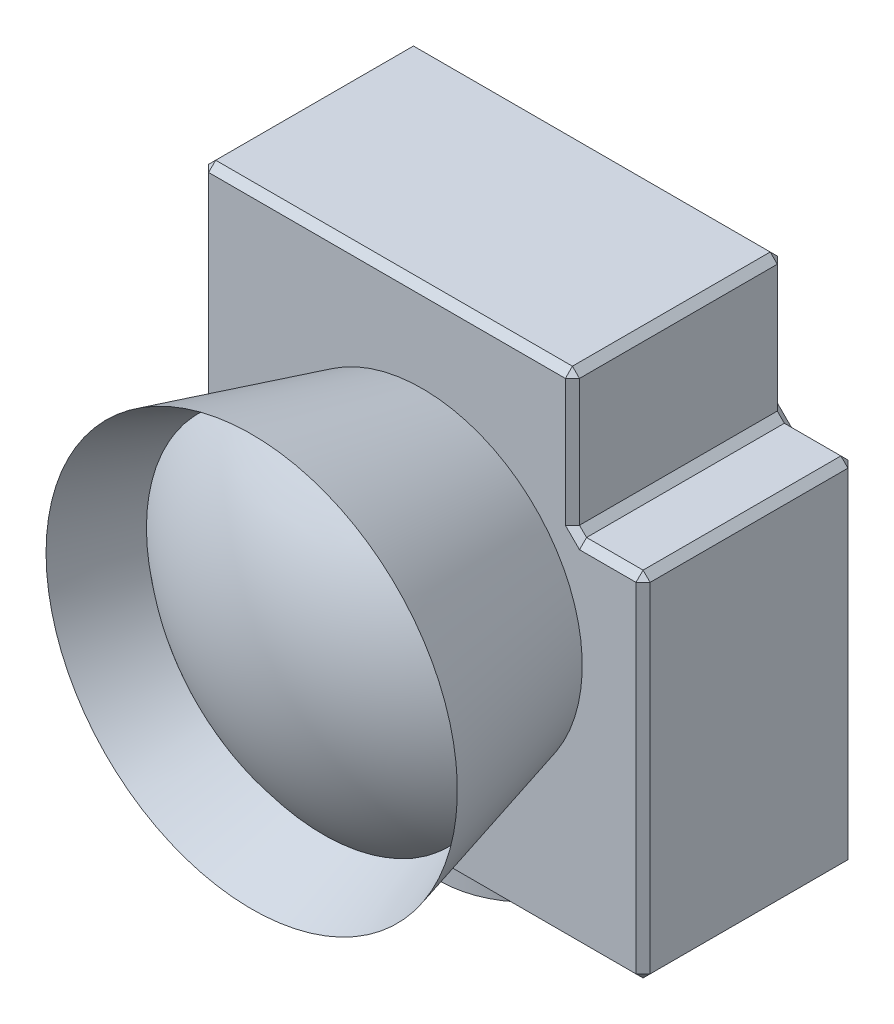
ISO-10303-21;
HEADER;
FILE_DESCRIPTION(('STEP AP214'),'2;1');
FILE_NAME('part.step','',(''),(''),'','','');
FILE_SCHEMA(('AUTOMOTIVE_DESIGN { 1 0 10303 214 1 1 1 1 }'));
ENDSEC;
DATA;
#1=APPLICATION_CONTEXT('core data for automotive mechanical design processes');
#2=APPLICATION_PROTOCOL_DEFINITION('international standard','automotive_design',2000,#1);
#3=PRODUCT_CONTEXT('',#1,'mechanical');
#4=PRODUCT('Part','Part','',(#3));
#5=PRODUCT_RELATED_PRODUCT_CATEGORY('part','',(#4));
#6=PRODUCT_DEFINITION_FORMATION('','',#4);
#7=PRODUCT_DEFINITION_CONTEXT('part definition',#1,'design');
#8=PRODUCT_DEFINITION('design','',#6,#7);
#9=PRODUCT_DEFINITION_SHAPE('','',#8);
#10=(LENGTH_UNIT() NAMED_UNIT(*) SI_UNIT(.MILLI.,.METRE.));
#11=(NAMED_UNIT(*) PLANE_ANGLE_UNIT() SI_UNIT($,.RADIAN.));
#12=(NAMED_UNIT(*) SI_UNIT($,.STERADIAN.) SOLID_ANGLE_UNIT());
#13=UNCERTAINTY_MEASURE_WITH_UNIT(LENGTH_MEASURE(1.E-05),#10,'distance_accuracy_value','');
#14=(GEOMETRIC_REPRESENTATION_CONTEXT(3) GLOBAL_UNCERTAINTY_ASSIGNED_CONTEXT((#13)) GLOBAL_UNIT_ASSIGNED_CONTEXT((#10,
#11,#12)) REPRESENTATION_CONTEXT('',''));
#15=CARTESIAN_POINT('',(0.,0.,0.));
#16=DIRECTION('',(0.,0.,1.));
#17=DIRECTION('',(1.,0.,0.));
#18=AXIS2_PLACEMENT_3D('',#15,#16,#17);
#19=CARTESIAN_POINT('',(0.,0.,33.7501562772454));
#20=CARTESIAN_POINT('',(-12.5291399374517,0.,33.7501562772454));
#21=CARTESIAN_POINT('',(-25.0582798749034,0.,28.9933194314533));
#22=B_SPLINE_CURVE_WITH_KNOTS('',2,(#19,#20,#21),.UNSPECIFIED.,.F.,.F.,(3,3),(0.,0.5),.UNSPECIFIED.);
#23=CARTESIAN_POINT('',(0.,0.,0.));
#24=DIRECTION('',(0.,0.,-1.));
#25=AXIS1_PLACEMENT('',#23,#24);
#26=SURFACE_OF_REVOLUTION('',#22,#25);
#27=CARTESIAN_POINT('',(0.,0.,28.9933194314533));
#28=DIRECTION('',(0.,0.,-1.));
#29=DIRECTION('',(-1.,0.,0.));
#30=AXIS2_PLACEMENT_3D('',#27,#28,#29);
#31=CIRCLE('',#30,25.0582798749034);
#32=CARTESIAN_POINT('',(-25.0582798749034,0.,28.9933194314533));
#33=VERTEX_POINT('',#32);
#34=EDGE_CURVE('E12',#33,#33,#31,.T.);
#35=ORIENTED_EDGE('',*,*,#34,.T.);
#36=EDGE_LOOP('',(#35));
#37=FACE_BOUND('',#36,.T.);
#38=CARTESIAN_POINT('',(0.,0.,33.7501562772454));
#39=VERTEX_POINT('',#38);
#40=VERTEX_LOOP('',#39);
#41=FACE_BOUND('',#40,.T.);
#42=ADVANCED_FACE('F49',(#37,#41),#26,.F.);
#43=CARTESIAN_POINT('',(0.,0.,0.));
#44=DIRECTION('',(0.,0.,-1.));
#45=DIRECTION('',(-1.,0.,0.));
#46=AXIS2_PLACEMENT_3D('',#43,#44,#45);
#47=SPHERICAL_SURFACE('',#46,38.3214034443322);
#48=ORIENTED_EDGE('',*,*,#34,.F.);
#49=EDGE_LOOP('',(#48));
#50=FACE_BOUND('',#49,.T.);
#51=ADVANCED_FACE('F58',(#50),#47,.T.);
#52=CLOSED_SHELL('',(#42,#51));
#53=MANIFOLD_SOLID_BREP('B2',#52);
#54=CARTESIAN_POINT('',(-31.25,35.,15.));
#55=DIRECTION('',(1.,0.,0.));
#56=DIRECTION('',(0.,1.,0.));
#57=AXIS2_PLACEMENT_3D('',#54,#55,#56);
#58=PLANE('',#57);
#59=DIRECTION('',(0.,-1.,0.));
#60=VECTOR('',#59,1.);
#61=CARTESIAN_POINT('',(-31.25,-35.,-14.));
#62=LINE('',#61,#60);
#63=CARTESIAN_POINT('',(-31.25,34.,-14.));
#64=VERTEX_POINT('',#63);
#65=CARTESIAN_POINT('',(-31.25,-34.,-14.));
#66=VERTEX_POINT('',#65);
#67=EDGE_CURVE('E382',#64,#66,#62,.T.);
#68=ORIENTED_EDGE('',*,*,#67,.T.);
#69=DIRECTION('',(0.,0.,1.));
#70=VECTOR('',#69,1.);
#71=CARTESIAN_POINT('',(-31.25,-34.,15.));
#72=LINE('',#71,#70);
#73=CARTESIAN_POINT('',(-31.25,-34.,14.));
#74=VERTEX_POINT('',#73);
#75=EDGE_CURVE('E388',#66,#74,#72,.T.);
#76=ORIENTED_EDGE('',*,*,#75,.T.);
#77=DIRECTION('',(0.,1.,0.));
#78=VECTOR('',#77,1.);
#79=CARTESIAN_POINT('',(-31.25,35.,14.));
#80=LINE('',#79,#78);
#81=CARTESIAN_POINT('',(-31.25,34.,14.));
#82=VERTEX_POINT('',#81);
#83=EDGE_CURVE('E386',#74,#82,#80,.T.);
#84=ORIENTED_EDGE('',*,*,#83,.T.);
#85=DIRECTION('',(0.,0.,-1.));
#86=VECTOR('',#85,1.);
#87=CARTESIAN_POINT('',(-31.25,34.,15.));
#88=LINE('',#87,#86);
#89=EDGE_CURVE('E384',#82,#64,#88,.T.);
#90=ORIENTED_EDGE('',*,*,#89,.T.);
#91=EDGE_LOOP('',(#68,#76,#84,#90));
#92=FACE_BOUND('',#91,.T.);
#93=ADVANCED_FACE('F88',(#92),#58,.F.);
#94=CARTESIAN_POINT('',(31.25,-35.,15.));
#95=DIRECTION('',(0.,1.,0.));
#96=DIRECTION('',(0.,0.,1.));
#97=AXIS2_PLACEMENT_3D('',#94,#95,#96);
#98=PLANE('',#97);
#99=DIRECTION('',(0.,0.,1.));
#100=VECTOR('',#99,1.);
#101=CARTESIAN_POINT('',(30.25,-35.,15.));
#102=LINE('',#101,#100);
#103=CARTESIAN_POINT('',(30.25,-35.,-14.));
#104=VERTEX_POINT('',#103);
#105=CARTESIAN_POINT('',(30.25,-35.,14.));
#106=VERTEX_POINT('',#105);
#107=EDGE_CURVE('E375',#104,#106,#102,.T.);
#108=ORIENTED_EDGE('',*,*,#107,.T.);
#109=DIRECTION('',(-1.,0.,0.));
#110=VECTOR('',#109,1.);
#111=CARTESIAN_POINT('',(31.25,-35.,14.));
#112=LINE('',#111,#110);
#113=CARTESIAN_POINT('',(-30.25,-35.,14.));
#114=VERTEX_POINT('',#113);
#115=EDGE_CURVE('E380',#106,#114,#112,.T.);
#116=ORIENTED_EDGE('',*,*,#115,.T.);
#117=DIRECTION('',(0.,0.,-1.));
#118=VECTOR('',#117,1.);
#119=CARTESIAN_POINT('',(-30.25,-35.,15.));
#120=LINE('',#119,#118);
#121=CARTESIAN_POINT('',(-30.25,-35.,-14.));
#122=VERTEX_POINT('',#121);
#123=EDGE_CURVE('E377',#114,#122,#120,.T.);
#124=ORIENTED_EDGE('',*,*,#123,.T.);
#125=DIRECTION('',(1.,0.,0.));
#126=VECTOR('',#125,1.);
#127=CARTESIAN_POINT('',(31.25,-35.,-14.));
#128=LINE('',#127,#126);
#129=EDGE_CURVE('E369',#122,#104,#128,.T.);
#130=ORIENTED_EDGE('',*,*,#129,.T.);
#131=EDGE_LOOP('',(#108,#116,#124,#130));
#132=FACE_BOUND('',#131,.T.);
#133=CARTESIAN_POINT('',(0.,-35.,0.));
#134=DIRECTION('',(0.,1.,0.));
#135=DIRECTION('',(0.,0.,1.));
#136=AXIS2_PLACEMENT_3D('',#133,#134,#135);
#137=CIRCLE('',#136,12.5);
#138=CARTESIAN_POINT('',(0.,-35.,12.5));
#139=VERTEX_POINT('',#138);
#140=EDGE_CURVE('E364',#139,#139,#137,.F.);
#141=ORIENTED_EDGE('',*,*,#140,.F.);
#142=EDGE_LOOP('',(#141));
#143=FACE_BOUND('',#142,.T.);
#144=ADVANCED_FACE('F520',(#132,#143),#98,.F.);
#145=CARTESIAN_POINT('',(31.25,15.,15.));
#146=DIRECTION('',(-1.,0.,0.));
#147=DIRECTION('',(0.,-1.,0.));
#148=AXIS2_PLACEMENT_3D('',#145,#146,#147);
#149=PLANE('',#148);
#150=DIRECTION('',(0.,0.,1.));
#151=VECTOR('',#150,1.);
#152=CARTESIAN_POINT('',(31.25,14.,15.));
#153=LINE('',#152,#151);
#154=CARTESIAN_POINT('',(31.25,14.,-14.));
#155=VERTEX_POINT('',#154);
#156=CARTESIAN_POINT('',(31.25,14.,14.));
#157=VERTEX_POINT('',#156);
#158=EDGE_CURVE('E393',#155,#157,#153,.T.);
#159=ORIENTED_EDGE('',*,*,#158,.T.);
#160=DIRECTION('',(0.,-1.,0.));
#161=VECTOR('',#160,1.);
#162=CARTESIAN_POINT('',(31.25,15.,14.));
#163=LINE('',#162,#161);
#164=CARTESIAN_POINT('',(31.25,-34.,14.));
#165=VERTEX_POINT('',#164);
#166=EDGE_CURVE('E398',#157,#165,#163,.T.);
#167=ORIENTED_EDGE('',*,*,#166,.T.);
#168=DIRECTION('',(0.,0.,-1.));
#169=VECTOR('',#168,1.);
#170=CARTESIAN_POINT('',(31.25,-34.,15.));
#171=LINE('',#170,#169);
#172=CARTESIAN_POINT('',(31.25,-34.,-14.));
#173=VERTEX_POINT('',#172);
#174=EDGE_CURVE('E395',#165,#173,#171,.T.);
#175=ORIENTED_EDGE('',*,*,#174,.T.);
#176=DIRECTION('',(0.,1.,0.));
#177=VECTOR('',#176,1.);
#178=CARTESIAN_POINT('',(31.25,15.,-14.));
#179=LINE('',#178,#177);
#180=EDGE_CURVE('E391',#173,#155,#179,.T.);
#181=ORIENTED_EDGE('',*,*,#180,.T.);
#182=EDGE_LOOP('',(#159,#167,#175,#181));
#183=FACE_BOUND('',#182,.T.);
#184=ADVANCED_FACE('F475',(#183),#149,.F.);
#185=CARTESIAN_POINT('',(31.25,15.,15.));
#186=DIRECTION('',(0.,-1.,0.));
#187=DIRECTION('',(1.,0.,0.));
#188=AXIS2_PLACEMENT_3D('',#185,#186,#187);
#189=PLANE('',#188);
#190=DIRECTION('',(0.,0.,1.));
#191=VECTOR('',#190,1.);
#192=CARTESIAN_POINT('',(22.25,15.,15.));
#193=LINE('',#192,#191);
#194=CARTESIAN_POINT('',(22.25,15.,-14.));
#195=VERTEX_POINT('',#194);
#196=CARTESIAN_POINT('',(22.25,15.,14.));
#197=VERTEX_POINT('',#196);
#198=EDGE_CURVE('E402',#195,#197,#193,.T.);
#199=ORIENTED_EDGE('',*,*,#198,.T.);
#200=DIRECTION('',(1.,0.,0.));
#201=VECTOR('',#200,1.);
#202=CARTESIAN_POINT('',(31.25,15.,14.));
#203=LINE('',#202,#201);
#204=CARTESIAN_POINT('',(30.25,15.,14.));
#205=VERTEX_POINT('',#204);
#206=EDGE_CURVE('E407',#197,#205,#203,.T.);
#207=ORIENTED_EDGE('',*,*,#206,.T.);
#208=DIRECTION('',(0.,0.,-1.));
#209=VECTOR('',#208,1.);
#210=CARTESIAN_POINT('',(30.25,15.,15.));
#211=LINE('',#210,#209);
#212=CARTESIAN_POINT('',(30.25,15.,-14.));
#213=VERTEX_POINT('',#212);
#214=EDGE_CURVE('E404',#205,#213,#211,.T.);
#215=ORIENTED_EDGE('',*,*,#214,.T.);
#216=DIRECTION('',(-1.,0.,0.));
#217=VECTOR('',#216,1.);
#218=CARTESIAN_POINT('',(21.25,15.,-14.));
#219=LINE('',#218,#217);
#220=EDGE_CURVE('E400',#213,#195,#219,.T.);
#221=ORIENTED_EDGE('',*,*,#220,.T.);
#222=EDGE_LOOP('',(#199,#207,#215,#221));
#223=FACE_BOUND('',#222,.T.);
#224=ADVANCED_FACE('F489',(#223),#189,.F.);
#225=CARTESIAN_POINT('',(21.25,35.,15.));
#226=DIRECTION('',(-1.,0.,0.));
#227=DIRECTION('',(0.,0.,1.));
#228=AXIS2_PLACEMENT_3D('',#225,#226,#227);
#229=PLANE('',#228);
#230=DIRECTION('',(0.,0.,1.));
#231=VECTOR('',#230,1.);
#232=CARTESIAN_POINT('',(21.25,34.,15.));
#233=LINE('',#232,#231);
#234=CARTESIAN_POINT('',(21.25,34.,-14.));
#235=VERTEX_POINT('',#234);
#236=CARTESIAN_POINT('',(21.25,34.,14.));
#237=VERTEX_POINT('',#236);
#238=EDGE_CURVE('E411',#235,#237,#233,.T.);
#239=ORIENTED_EDGE('',*,*,#238,.T.);
#240=DIRECTION('',(0.,-1.,0.));
#241=VECTOR('',#240,1.);
#242=CARTESIAN_POINT('',(21.25,35.,14.));
#243=LINE('',#242,#241);
#244=CARTESIAN_POINT('',(21.25,16.,14.));
#245=VERTEX_POINT('',#244);
#246=EDGE_CURVE('E416',#237,#245,#243,.T.);
#247=ORIENTED_EDGE('',*,*,#246,.T.);
#248=DIRECTION('',(0.,0.,-1.));
#249=VECTOR('',#248,1.);
#250=CARTESIAN_POINT('',(21.25,16.,-15.));
#251=LINE('',#250,#249);
#252=CARTESIAN_POINT('',(21.25,16.,-14.));
#253=VERTEX_POINT('',#252);
#254=EDGE_CURVE('E413',#245,#253,#251,.T.);
#255=ORIENTED_EDGE('',*,*,#254,.T.);
#256=DIRECTION('',(0.,1.,0.));
#257=VECTOR('',#256,1.);
#258=CARTESIAN_POINT('',(21.25,35.,-14.));
#259=LINE('',#258,#257);
#260=EDGE_CURVE('E409',#253,#235,#259,.T.);
#261=ORIENTED_EDGE('',*,*,#260,.T.);
#262=EDGE_LOOP('',(#239,#247,#255,#261));
#263=FACE_BOUND('',#262,.T.);
#264=ADVANCED_FACE('F495',(#263),#229,.F.);
#265=CARTESIAN_POINT('',(21.25,35.,15.));
#266=DIRECTION('',(0.,-1.,0.));
#267=DIRECTION('',(1.,0.,0.));
#268=AXIS2_PLACEMENT_3D('',#265,#266,#267);
#269=PLANE('',#268);
#270=DIRECTION('',(1.,0.,0.));
#271=VECTOR('',#270,1.);
#272=CARTESIAN_POINT('',(21.25,35.,14.));
#273=LINE('',#272,#271);
#274=CARTESIAN_POINT('',(-30.25,35.,14.));
#275=VERTEX_POINT('',#274);
#276=CARTESIAN_POINT('',(20.25,35.,14.));
#277=VERTEX_POINT('',#276);
#278=EDGE_CURVE('E422',#275,#277,#273,.T.);
#279=ORIENTED_EDGE('',*,*,#278,.T.);
#280=DIRECTION('',(0.,0.,-1.));
#281=VECTOR('',#280,1.);
#282=CARTESIAN_POINT('',(20.25,35.,15.));
#283=LINE('',#282,#281);
#284=CARTESIAN_POINT('',(20.25,35.,-14.));
#285=VERTEX_POINT('',#284);
#286=EDGE_CURVE('E424',#277,#285,#283,.T.);
#287=ORIENTED_EDGE('',*,*,#286,.T.);
#288=DIRECTION('',(-1.,0.,0.));
#289=VECTOR('',#288,1.);
#290=CARTESIAN_POINT('',(-31.25,35.,-14.));
#291=LINE('',#290,#289);
#292=CARTESIAN_POINT('',(-30.25,35.,-14.));
#293=VERTEX_POINT('',#292);
#294=EDGE_CURVE('E418',#285,#293,#291,.T.);
#295=ORIENTED_EDGE('',*,*,#294,.T.);
#296=DIRECTION('',(0.,0.,1.));
#297=VECTOR('',#296,1.);
#298=CARTESIAN_POINT('',(-30.25,35.,15.));
#299=LINE('',#298,#297);
#300=EDGE_CURVE('E420',#293,#275,#299,.T.);
#301=ORIENTED_EDGE('',*,*,#300,.T.);
#302=EDGE_LOOP('',(#279,#287,#295,#301));
#303=FACE_BOUND('',#302,.T.);
#304=ADVANCED_FACE('F706',(#303),#269,.F.);
#305=CARTESIAN_POINT('',(0.,0.,15.));
#306=DIRECTION('',(0.,0.,-1.));
#307=DIRECTION('',(-1.,0.,0.));
#308=AXIS2_PLACEMENT_3D('',#305,#306,#307);
#309=PLANE('',#308);
#310=CARTESIAN_POINT('',(0.,0.,15.));
#311=DIRECTION('',(0.,0.,-1.));
#312=DIRECTION('',(-1.,0.,0.));
#313=AXIS2_PLACEMENT_3D('',#310,#311,#312);
#314=CIRCLE('',#313,22.6402714347078);
#315=CARTESIAN_POINT('',(-22.6402714347078,0.,15.));
#316=VERTEX_POINT('',#315);
#317=EDGE_CURVE('E1069',#316,#316,#314,.T.);
#318=ORIENTED_EDGE('',*,*,#317,.T.);
#319=EDGE_LOOP('',(#318));
#320=FACE_BOUND('',#319,.T.);
#321=DIRECTION('',(0.707106781186548,-0.707106781186547,0.));
#322=VECTOR('',#321,1.);
#323=CARTESIAN_POINT('',(22.25,14.,15.));
#324=LINE('',#323,#322);
#325=CARTESIAN_POINT('',(20.25,16.,15.));
#326=VERTEX_POINT('',#325);
#327=CARTESIAN_POINT('',(21.25,15.,15.));
#328=VERTEX_POINT('',#327);
#329=EDGE_CURVE('E230',#326,#328,#324,.T.);
#330=ORIENTED_EDGE('',*,*,#329,.F.);
#331=DIRECTION('',(0.,1.,0.));
#332=VECTOR('',#331,1.);
#333=CARTESIAN_POINT('',(20.25,0.,15.));
#334=LINE('',#333,#332);
#335=CARTESIAN_POINT('',(20.25,34.,15.));
#336=VERTEX_POINT('',#335);
#337=EDGE_CURVE('E244',#326,#336,#334,.T.);
#338=ORIENTED_EDGE('',*,*,#337,.T.);
#339=DIRECTION('',(-1.,0.,0.));
#340=VECTOR('',#339,1.);
#341=CARTESIAN_POINT('',(0.,34.,15.));
#342=LINE('',#341,#340);
#343=CARTESIAN_POINT('',(-30.25,34.,15.));
#344=VERTEX_POINT('',#343);
#345=EDGE_CURVE('E237',#336,#344,#342,.T.);
#346=ORIENTED_EDGE('',*,*,#345,.T.);
#347=DIRECTION('',(0.,-1.,0.));
#348=VECTOR('',#347,1.);
#349=CARTESIAN_POINT('',(-30.25,0.,15.));
#350=LINE('',#349,#348);
#351=CARTESIAN_POINT('',(-30.25,-34.,15.));
#352=VERTEX_POINT('',#351);
#353=EDGE_CURVE('E427',#344,#352,#350,.T.);
#354=ORIENTED_EDGE('',*,*,#353,.T.);
#355=DIRECTION('',(1.,0.,0.));
#356=VECTOR('',#355,1.);
#357=CARTESIAN_POINT('',(0.,-34.,15.));
#358=LINE('',#357,#356);
#359=CARTESIAN_POINT('',(30.25,-34.,15.));
#360=VERTEX_POINT('',#359);
#361=EDGE_CURVE('E429',#352,#360,#358,.T.);
#362=ORIENTED_EDGE('',*,*,#361,.T.);
#363=DIRECTION('',(0.,1.,0.));
#364=VECTOR('',#363,1.);
#365=CARTESIAN_POINT('',(30.25,0.,15.));
#366=LINE('',#365,#364);
#367=CARTESIAN_POINT('',(30.25,14.,15.));
#368=VERTEX_POINT('',#367);
#369=EDGE_CURVE('E431',#360,#368,#366,.T.);
#370=ORIENTED_EDGE('',*,*,#369,.T.);
#371=DIRECTION('',(-1.,0.,0.));
#372=VECTOR('',#371,1.);
#373=CARTESIAN_POINT('',(0.,13.9999999999999,15.));
#374=LINE('',#373,#372);
#375=CARTESIAN_POINT('',(22.25,14.,15.));
#376=VERTEX_POINT('',#375);
#377=EDGE_CURVE('E233',#368,#376,#374,.T.);
#378=ORIENTED_EDGE('',*,*,#377,.T.);
#379=DIRECTION('',(0.707106781186548,-0.707106781186547,0.));
#380=VECTOR('',#379,1.);
#381=CARTESIAN_POINT('',(22.25,14.,15.));
#382=LINE('',#381,#380);
#383=EDGE_CURVE('E227',#328,#376,#382,.T.);
#384=ORIENTED_EDGE('',*,*,#383,.F.);
#385=EDGE_LOOP('',(#330,#338,#346,#354,#362,#370,#378,#384));
#386=FACE_BOUND('',#385,.T.);
#387=ADVANCED_FACE('F229',(#320,#386),#309,.F.);
#388=CARTESIAN_POINT('',(0.,0.,-15.));
#389=DIRECTION('',(0.,0.,-1.));
#390=DIRECTION('',(-1.,0.,0.));
#391=AXIS2_PLACEMENT_3D('',#388,#389,#390);
#392=PLANE('',#391);
#393=DIRECTION('',(1.,0.,0.));
#394=VECTOR('',#393,1.);
#395=CARTESIAN_POINT('',(21.25,34.,-15.));
#396=LINE('',#395,#394);
#397=CARTESIAN_POINT('',(-30.25,34.,-15.));
#398=VERTEX_POINT('',#397);
#399=CARTESIAN_POINT('',(20.25,34.,-15.));
#400=VERTEX_POINT('',#399);
#401=EDGE_CURVE('E260',#398,#400,#396,.T.);
#402=ORIENTED_EDGE('',*,*,#401,.T.);
#403=DIRECTION('',(0.,-1.,0.));
#404=VECTOR('',#403,1.);
#405=CARTESIAN_POINT('',(20.25,15.,-15.));
#406=LINE('',#405,#404);
#407=CARTESIAN_POINT('',(20.25,16.,-15.));
#408=VERTEX_POINT('',#407);
#409=EDGE_CURVE('E47',#400,#408,#406,.T.);
#410=ORIENTED_EDGE('',*,*,#409,.T.);
#411=DIRECTION('',(-0.707106781186548,0.707106781186547,0.));
#412=VECTOR('',#411,1.);
#413=CARTESIAN_POINT('',(18.125,18.125,-15.));
#414=LINE('',#413,#412);
#415=CARTESIAN_POINT('',(21.25,15.,-15.));
#416=VERTEX_POINT('',#415);
#417=EDGE_CURVE('E98',#416,#408,#414,.T.);
#418=ORIENTED_EDGE('',*,*,#417,.F.);
#419=DIRECTION('',(-0.707106781186548,0.707106781186547,0.));
#420=VECTOR('',#419,1.);
#421=CARTESIAN_POINT('',(18.125,18.125,-15.));
#422=LINE('',#421,#420);
#423=CARTESIAN_POINT('',(22.25,14.,-15.));
#424=VERTEX_POINT('',#423);
#425=EDGE_CURVE('E257',#424,#416,#422,.T.);
#426=ORIENTED_EDGE('',*,*,#425,.F.);
#427=DIRECTION('',(1.,0.,0.));
#428=VECTOR('',#427,1.);
#429=CARTESIAN_POINT('',(31.25,14.,-15.));
#430=LINE('',#429,#428);
#431=CARTESIAN_POINT('',(30.25,14.,-15.));
#432=VERTEX_POINT('',#431);
#433=EDGE_CURVE('E255',#424,#432,#430,.T.);
#434=ORIENTED_EDGE('',*,*,#433,.T.);
#435=DIRECTION('',(0.,-1.,0.));
#436=VECTOR('',#435,1.);
#437=CARTESIAN_POINT('',(30.25,-35.,-15.));
#438=LINE('',#437,#436);
#439=CARTESIAN_POINT('',(30.25,-34.,-15.));
#440=VERTEX_POINT('',#439);
#441=EDGE_CURVE('E253',#432,#440,#438,.T.);
#442=ORIENTED_EDGE('',*,*,#441,.T.);
#443=DIRECTION('',(-1.,0.,0.));
#444=VECTOR('',#443,1.);
#445=CARTESIAN_POINT('',(-31.25,-34.,-15.));
#446=LINE('',#445,#444);
#447=CARTESIAN_POINT('',(-30.25,-34.,-15.));
#448=VERTEX_POINT('',#447);
#449=EDGE_CURVE('E251',#440,#448,#446,.T.);
#450=ORIENTED_EDGE('',*,*,#449,.T.);
#451=DIRECTION('',(0.,1.,0.));
#452=VECTOR('',#451,1.);
#453=CARTESIAN_POINT('',(-30.25,35.,-15.));
#454=LINE('',#453,#452);
#455=EDGE_CURVE('E246',#448,#398,#454,.T.);
#456=ORIENTED_EDGE('',*,*,#455,.T.);
#457=EDGE_LOOP('',(#402,#410,#418,#426,#434,#442,#450,#456));
#458=FACE_BOUND('',#457,.T.);
#459=ADVANCED_FACE('F698',(#458),#392,.T.);
#460=CARTESIAN_POINT('',(0.,-39.,0.));
#461=DIRECTION('',(0.,1.,0.));
#462=DIRECTION('',(0.,0.,1.));
#463=AXIS2_PLACEMENT_3D('',#460,#461,#462);
#464=CYLINDRICAL_SURFACE('',#463,12.5);
#465=CARTESIAN_POINT('',(0.,-39.,0.));
#466=DIRECTION('',(0.,-1.,0.));
#467=DIRECTION('',(0.,0.,-1.));
#468=AXIS2_PLACEMENT_3D('',#465,#466,#467);
#469=CIRCLE('',#468,12.5);
#470=CARTESIAN_POINT('',(0.,-39.,-12.5));
#471=VERTEX_POINT('',#470);
#472=EDGE_CURVE('E361',#471,#471,#469,.T.);
#473=ORIENTED_EDGE('',*,*,#472,.F.);
#474=EDGE_LOOP('',(#473));
#475=FACE_BOUND('',#474,.T.);
#476=ORIENTED_EDGE('',*,*,#140,.T.);
#477=EDGE_LOOP('',(#476));
#478=FACE_BOUND('',#477,.T.);
#479=ADVANCED_FACE('F693',(#475,#478),#464,.T.);
#480=CARTESIAN_POINT('',(0.,-39.,0.));
#481=DIRECTION('',(0.,-1.,0.));
#482=DIRECTION('',(0.,0.,-1.));
#483=AXIS2_PLACEMENT_3D('',#480,#481,#482);
#484=PLANE('',#483);
#485=ORIENTED_EDGE('',*,*,#472,.T.);
#486=EDGE_LOOP('',(#485));
#487=FACE_BOUND('',#486,.T.);
#488=ADVANCED_FACE('F689',(#487),#484,.T.);
#489=CARTESIAN_POINT('',(21.25,16.,15.));
#490=DIRECTION('',(0.707106781186547,0.707106781186548,0.));
#491=DIRECTION('',(0.,0.,1.));
#492=AXIS2_PLACEMENT_3D('',#489,#490,#491);
#493=PLANE('',#492);
#494=DIRECTION('',(0.707106781186548,-0.707106781186547,0.));
#495=VECTOR('',#494,1.);
#496=CARTESIAN_POINT('',(22.25,15.,14.));
#497=LINE('',#496,#495);
#498=EDGE_CURVE('E93',#197,#245,#497,.F.);
#499=ORIENTED_EDGE('',*,*,#498,.F.);
#500=ORIENTED_EDGE('',*,*,#198,.F.);
#501=DIRECTION('',(-0.707106781186548,0.707106781186547,0.));
#502=VECTOR('',#501,1.);
#503=CARTESIAN_POINT('',(21.25,16.,-14.));
#504=LINE('',#503,#502);
#505=EDGE_CURVE('E355',#253,#195,#504,.F.);
#506=ORIENTED_EDGE('',*,*,#505,.F.);
#507=ORIENTED_EDGE('',*,*,#254,.F.);
#508=EDGE_LOOP('',(#499,#500,#506,#507));
#509=FACE_BOUND('',#508,.T.);
#510=ADVANCED_FACE('F91',(#509),#493,.T.);
#511=CARTESIAN_POINT('',(22.25,15.,14.));
#512=DIRECTION('',(0.577350269189625,0.577350269189626,0.577350269189626));
#513=DIRECTION('',(0.,-0.707106781186548,0.707106781186548));
#514=AXIS2_PLACEMENT_3D('',#511,#512,#513);
#515=PLANE('',#514);
#516=DIRECTION('',(0.,0.707106781186547,-0.707106781186547));
#517=VECTOR('',#516,1.);
#518=CARTESIAN_POINT('',(22.25,14.,15.));
#519=LINE('',#518,#517);
#520=EDGE_CURVE('E353',#197,#376,#519,.F.);
#521=ORIENTED_EDGE('',*,*,#520,.F.);
#522=ORIENTED_EDGE('',*,*,#498,.T.);
#523=DIRECTION('',(-0.707106781186547,0.,0.707106781186547));
#524=VECTOR('',#523,1.);
#525=CARTESIAN_POINT('',(21.25,16.,14.));
#526=LINE('',#525,#524);
#527=EDGE_CURVE('E242',#326,#245,#526,.F.);
#528=ORIENTED_EDGE('',*,*,#527,.F.);
#529=ORIENTED_EDGE('',*,*,#329,.T.);
#530=ORIENTED_EDGE('',*,*,#383,.T.);
#531=EDGE_LOOP('',(#521,#522,#528,#529,#530));
#532=FACE_BOUND('',#531,.T.);
#533=ADVANCED_FACE('F239',(#532),#515,.T.);
#534=CARTESIAN_POINT('',(21.25,16.,-14.));
#535=DIRECTION('',(0.577350269189626,0.577350269189627,-0.577350269189626));
#536=DIRECTION('',(0.,0.707106781186547,0.707106781186548));
#537=AXIS2_PLACEMENT_3D('',#534,#535,#536);
#538=PLANE('',#537);
#539=DIRECTION('',(0.707106781186547,0.,0.707106781186547));
#540=VECTOR('',#539,1.);
#541=CARTESIAN_POINT('',(20.25,16.,-15.));
#542=LINE('',#541,#540);
#543=EDGE_CURVE('E347',#253,#408,#542,.F.);
#544=ORIENTED_EDGE('',*,*,#543,.F.);
#545=ORIENTED_EDGE('',*,*,#505,.T.);
#546=DIRECTION('',(0.,-0.707106781186547,-0.707106781186547));
#547=VECTOR('',#546,1.);
#548=CARTESIAN_POINT('',(22.25,15.,-14.));
#549=LINE('',#548,#547);
#550=EDGE_CURVE('E350',#424,#195,#549,.F.);
#551=ORIENTED_EDGE('',*,*,#550,.F.);
#552=ORIENTED_EDGE('',*,*,#425,.T.);
#553=ORIENTED_EDGE('',*,*,#417,.T.);
#554=EDGE_LOOP('',(#544,#545,#551,#552,#553));
#555=FACE_BOUND('',#554,.T.);
#556=ADVANCED_FACE('F679',(#555),#538,.T.);
#557=CARTESIAN_POINT('',(20.25,0.,15.));
#558=DIRECTION('',(-0.707106781186547,0.,-0.707106781186547));
#559=DIRECTION('',(0.,1.,0.));
#560=AXIS2_PLACEMENT_3D('',#557,#558,#559);
#561=PLANE('',#560);
#562=ORIENTED_EDGE('',*,*,#527,.T.);
#563=ORIENTED_EDGE('',*,*,#246,.F.);
#564=DIRECTION('',(-0.707106781186548,0.,0.707106781186548));
#565=VECTOR('',#564,1.);
#566=CARTESIAN_POINT('',(21.25,34.,14.));
#567=LINE('',#566,#565);
#568=EDGE_CURVE('E341',#336,#237,#567,.F.);
#569=ORIENTED_EDGE('',*,*,#568,.F.);
#570=ORIENTED_EDGE('',*,*,#337,.F.);
#571=EDGE_LOOP('',(#562,#563,#569,#570));
#572=FACE_BOUND('',#571,.T.);
#573=ADVANCED_FACE('F500',(#572),#561,.F.);
#574=CARTESIAN_POINT('',(0.,13.9999999999999,15.));
#575=DIRECTION('',(0.,-0.707106781186547,-0.707106781186548));
#576=DIRECTION('',(-1.,0.,0.));
#577=AXIS2_PLACEMENT_3D('',#574,#575,#576);
#578=PLANE('',#577);
#579=ORIENTED_EDGE('',*,*,#520,.T.);
#580=ORIENTED_EDGE('',*,*,#377,.F.);
#581=DIRECTION('',(0.,0.707106781186548,-0.707106781186547));
#582=VECTOR('',#581,1.);
#583=CARTESIAN_POINT('',(30.25,14.5,14.5));
#584=LINE('',#583,#582);
#585=EDGE_CURVE('E338',#205,#368,#584,.F.);
#586=ORIENTED_EDGE('',*,*,#585,.F.);
#587=ORIENTED_EDGE('',*,*,#206,.F.);
#588=EDGE_LOOP('',(#579,#580,#586,#587));
#589=FACE_BOUND('',#588,.T.);
#590=ADVANCED_FACE('F487',(#589),#578,.F.);
#591=CARTESIAN_POINT('',(30.25,15.,15.));
#592=DIRECTION('',(-0.707106781186547,-0.707106781186547,0.));
#593=DIRECTION('',(0.,0.,-1.));
#594=AXIS2_PLACEMENT_3D('',#591,#592,#593);
#595=PLANE('',#594);
#596=DIRECTION('',(-0.707106781186547,0.707106781186547,0.));
#597=VECTOR('',#596,1.);
#598=CARTESIAN_POINT('',(30.25,15.,-14.));
#599=LINE('',#598,#597);
#600=EDGE_CURVE('E332',#213,#155,#599,.F.);
#601=ORIENTED_EDGE('',*,*,#600,.F.);
#602=ORIENTED_EDGE('',*,*,#214,.F.);
#603=DIRECTION('',(0.707106781186547,-0.707106781186547,0.));
#604=VECTOR('',#603,1.);
#605=CARTESIAN_POINT('',(31.25,14.,14.));
#606=LINE('',#605,#604);
#607=EDGE_CURVE('E335',#157,#205,#606,.F.);
#608=ORIENTED_EDGE('',*,*,#607,.F.);
#609=ORIENTED_EDGE('',*,*,#158,.F.);
#610=EDGE_LOOP('',(#601,#602,#608,#609));
#611=FACE_BOUND('',#610,.T.);
#612=ADVANCED_FACE('F481',(#611),#595,.F.);
#613=CARTESIAN_POINT('',(31.25,15.,-14.));
#614=DIRECTION('',(0.,0.707106781186547,-0.707106781186548));
#615=DIRECTION('',(1.,0.,0.));
#616=AXIS2_PLACEMENT_3D('',#613,#614,#615);
#617=PLANE('',#616);
#618=ORIENTED_EDGE('',*,*,#550,.T.);
#619=ORIENTED_EDGE('',*,*,#220,.F.);
#620=DIRECTION('',(0.,0.707106781186548,0.707106781186547));
#621=VECTOR('',#620,1.);
#622=CARTESIAN_POINT('',(30.25,15.,-14.));
#623=LINE('',#622,#621);
#624=EDGE_CURVE('E330',#432,#213,#623,.T.);
#625=ORIENTED_EDGE('',*,*,#624,.F.);
#626=ORIENTED_EDGE('',*,*,#433,.F.);
#627=EDGE_LOOP('',(#618,#619,#625,#626));
#628=FACE_BOUND('',#627,.T.);
#629=ADVANCED_FACE('F662',(#628),#617,.T.);
#630=CARTESIAN_POINT('',(21.25,35.,-14.));
#631=DIRECTION('',(0.707106781186547,0.,-0.707106781186547));
#632=DIRECTION('',(0.,-1.,0.));
#633=AXIS2_PLACEMENT_3D('',#630,#631,#632);
#634=PLANE('',#633);
#635=ORIENTED_EDGE('',*,*,#543,.T.);
#636=ORIENTED_EDGE('',*,*,#409,.F.);
#637=DIRECTION('',(-0.707106781186548,0.,-0.707106781186548));
#638=VECTOR('',#637,1.);
#639=CARTESIAN_POINT('',(20.75,34.,-14.5));
#640=LINE('',#639,#638);
#641=EDGE_CURVE('E328',#235,#400,#640,.T.);
#642=ORIENTED_EDGE('',*,*,#641,.F.);
#643=ORIENTED_EDGE('',*,*,#260,.F.);
#644=EDGE_LOOP('',(#635,#636,#642,#643));
#645=FACE_BOUND('',#644,.T.);
#646=ADVANCED_FACE('F516',(#645),#634,.T.);
#647=CARTESIAN_POINT('',(20.25,35.,15.));
#648=DIRECTION('',(-0.707106781186547,-0.707106781186547,0.));
#649=DIRECTION('',(0.,0.,-1.));
#650=AXIS2_PLACEMENT_3D('',#647,#648,#649);
#651=PLANE('',#650);
#652=DIRECTION('',(0.707106781186548,-0.707106781186548,0.));
#653=VECTOR('',#652,1.);
#654=CARTESIAN_POINT('',(21.25,34.,14.));
#655=LINE('',#654,#653);
#656=EDGE_CURVE('E344',#237,#277,#655,.F.);
#657=ORIENTED_EDGE('',*,*,#656,.F.);
#658=ORIENTED_EDGE('',*,*,#238,.F.);
#659=DIRECTION('',(-0.707106781186548,0.707106781186548,0.));
#660=VECTOR('',#659,1.);
#661=CARTESIAN_POINT('',(20.25,35.,-14.));
#662=LINE('',#661,#660);
#663=EDGE_CURVE('E325',#285,#235,#662,.F.);
#664=ORIENTED_EDGE('',*,*,#663,.F.);
#665=ORIENTED_EDGE('',*,*,#286,.F.);
#666=EDGE_LOOP('',(#657,#658,#664,#665));
#667=FACE_BOUND('',#666,.T.);
#668=ADVANCED_FACE('F503',(#667),#651,.F.);
#669=CARTESIAN_POINT('',(21.25,34.,14.));
#670=DIRECTION('',(0.577350269189627,0.577350269189627,0.577350269189623));
#671=DIRECTION('',(-0.707106781186548,0.707106781186548,0.));
#672=AXIS2_PLACEMENT_3D('',#669,#670,#671);
#673=PLANE('',#672);
#674=ORIENTED_EDGE('',*,*,#568,.T.);
#675=ORIENTED_EDGE('',*,*,#656,.T.);
#676=DIRECTION('',(0.,0.707106781186546,-0.707106781186549));
#677=VECTOR('',#676,1.);
#678=CARTESIAN_POINT('',(20.25,34.5,14.5));
#679=LINE('',#678,#677);
#680=EDGE_CURVE('E322',#336,#277,#679,.T.);
#681=ORIENTED_EDGE('',*,*,#680,.F.);
#682=EDGE_LOOP('',(#674,#675,#681));
#683=FACE_BOUND('',#682,.T.);
#684=ADVANCED_FACE('F507',(#683),#673,.T.);
#685=CARTESIAN_POINT('',(31.25,14.,14.));
#686=DIRECTION('',(0.577350269189626,0.577350269189626,0.577350269189626));
#687=DIRECTION('',(0.707106781186547,0.,-0.707106781186547));
#688=AXIS2_PLACEMENT_3D('',#685,#686,#687);
#689=PLANE('',#688);
#690=ORIENTED_EDGE('',*,*,#607,.T.);
#691=ORIENTED_EDGE('',*,*,#585,.T.);
#692=DIRECTION('',(-0.707106781186548,0.,0.707106781186547));
#693=VECTOR('',#692,1.);
#694=CARTESIAN_POINT('',(31.25,14.,14.));
#695=LINE('',#694,#693);
#696=EDGE_CURVE('E319',#157,#368,#695,.T.);
#697=ORIENTED_EDGE('',*,*,#696,.F.);
#698=EDGE_LOOP('',(#690,#691,#697));
#699=FACE_BOUND('',#698,.T.);
#700=ADVANCED_FACE('F484',(#699),#689,.T.);
#701=CARTESIAN_POINT('',(30.25,15.,-14.));
#702=DIRECTION('',(0.577350269189626,0.577350269189626,-0.577350269189626));
#703=DIRECTION('',(-0.707106781186547,0.,-0.707106781186547));
#704=AXIS2_PLACEMENT_3D('',#701,#702,#703);
#705=PLANE('',#704);
#706=ORIENTED_EDGE('',*,*,#624,.T.);
#707=ORIENTED_EDGE('',*,*,#600,.T.);
#708=DIRECTION('',(-0.707106781186548,0.,-0.707106781186547));
#709=VECTOR('',#708,1.);
#710=CARTESIAN_POINT('',(30.75,14.,-14.5));
#711=LINE('',#710,#709);
#712=EDGE_CURVE('E316',#432,#155,#711,.F.);
#713=ORIENTED_EDGE('',*,*,#712,.F.);
#714=EDGE_LOOP('',(#706,#707,#713));
#715=FACE_BOUND('',#714,.T.);
#716=ADVANCED_FACE('F514',(#715),#705,.T.);
#717=CARTESIAN_POINT('',(20.25,35.,-14.));
#718=DIRECTION('',(0.577350269189627,0.577350269189627,-0.577350269189623));
#719=DIRECTION('',(-0.707106781186548,0.707106781186548,0.));
#720=AXIS2_PLACEMENT_3D('',#717,#718,#719);
#721=PLANE('',#720);
#722=ORIENTED_EDGE('',*,*,#663,.T.);
#723=ORIENTED_EDGE('',*,*,#641,.T.);
#724=DIRECTION('',(0.,0.707106781186546,0.707106781186549));
#725=VECTOR('',#724,1.);
#726=CARTESIAN_POINT('',(20.25,35.,-14.));
#727=LINE('',#726,#725);
#728=EDGE_CURVE('E112',#285,#400,#727,.F.);
#729=ORIENTED_EDGE('',*,*,#728,.F.);
#730=EDGE_LOOP('',(#722,#723,#729));
#731=FACE_BOUND('',#730,.T.);
#732=ADVANCED_FACE('F634',(#731),#721,.T.);
#733=CARTESIAN_POINT('',(0.,34.,15.));
#734=DIRECTION('',(0.,-0.707106781186549,-0.707106781186546));
#735=DIRECTION('',(-1.,0.,0.));
#736=AXIS2_PLACEMENT_3D('',#733,#734,#735);
#737=PLANE('',#736);
#738=ORIENTED_EDGE('',*,*,#680,.T.);
#739=ORIENTED_EDGE('',*,*,#278,.F.);
#740=DIRECTION('',(0.,-0.707106781186546,0.707106781186549));
#741=VECTOR('',#740,1.);
#742=CARTESIAN_POINT('',(-30.25,34.,15.));
#743=LINE('',#742,#741);
#744=EDGE_CURVE('E309',#344,#275,#743,.F.);
#745=ORIENTED_EDGE('',*,*,#744,.F.);
#746=ORIENTED_EDGE('',*,*,#345,.F.);
#747=EDGE_LOOP('',(#738,#739,#745,#746));
#748=FACE_BOUND('',#747,.T.);
#749=ADVANCED_FACE('F439',(#748),#737,.F.);
#750=CARTESIAN_POINT('',(30.25,0.,15.));
#751=DIRECTION('',(-0.707106781186547,0.,-0.707106781186548));
#752=DIRECTION('',(0.,1.,0.));
#753=AXIS2_PLACEMENT_3D('',#750,#751,#752);
#754=PLANE('',#753);
#755=ORIENTED_EDGE('',*,*,#696,.T.);
#756=ORIENTED_EDGE('',*,*,#369,.F.);
#757=DIRECTION('',(0.707106781186548,0.,-0.707106781186547));
#758=VECTOR('',#757,1.);
#759=CARTESIAN_POINT('',(30.75,-34.,14.5));
#760=LINE('',#759,#758);
#761=EDGE_CURVE('E306',#165,#360,#760,.F.);
#762=ORIENTED_EDGE('',*,*,#761,.F.);
#763=ORIENTED_EDGE('',*,*,#166,.F.);
#764=EDGE_LOOP('',(#755,#756,#762,#763));
#765=FACE_BOUND('',#764,.T.);
#766=ADVANCED_FACE('F462',(#765),#754,.F.);
#767=CARTESIAN_POINT('',(31.25,-34.,15.));
#768=DIRECTION('',(-0.707106781186547,0.707106781186547,0.));
#769=DIRECTION('',(0.,0.,-1.));
#770=AXIS2_PLACEMENT_3D('',#767,#768,#769);
#771=PLANE('',#770);
#772=DIRECTION('',(0.707106781186547,0.707106781186547,0.));
#773=VECTOR('',#772,1.);
#774=CARTESIAN_POINT('',(31.25,-34.,-14.));
#775=LINE('',#774,#773);
#776=EDGE_CURVE('E300',#173,#104,#775,.F.);
#777=ORIENTED_EDGE('',*,*,#776,.F.);
#778=ORIENTED_EDGE('',*,*,#174,.F.);
#779=DIRECTION('',(-0.707106781186547,-0.707106781186547,0.));
#780=VECTOR('',#779,1.);
#781=CARTESIAN_POINT('',(30.25,-35.,14.));
#782=LINE('',#781,#780);
#783=EDGE_CURVE('E303',#106,#165,#782,.F.);
#784=ORIENTED_EDGE('',*,*,#783,.F.);
#785=ORIENTED_EDGE('',*,*,#107,.F.);
#786=EDGE_LOOP('',(#777,#778,#784,#785));
#787=FACE_BOUND('',#786,.T.);
#788=ADVANCED_FACE('F472',(#787),#771,.F.);
#789=CARTESIAN_POINT('',(31.25,15.,-14.));
#790=DIRECTION('',(0.707106781186547,0.,-0.707106781186548));
#791=DIRECTION('',(0.,-1.,0.));
#792=AXIS2_PLACEMENT_3D('',#789,#790,#791);
#793=PLANE('',#792);
#794=ORIENTED_EDGE('',*,*,#712,.T.);
#795=ORIENTED_EDGE('',*,*,#180,.F.);
#796=DIRECTION('',(0.707106781186548,0.,0.707106781186547));
#797=VECTOR('',#796,1.);
#798=CARTESIAN_POINT('',(31.25,-34.,-14.));
#799=LINE('',#798,#797);
#800=EDGE_CURVE('E298',#440,#173,#799,.T.);
#801=ORIENTED_EDGE('',*,*,#800,.F.);
#802=ORIENTED_EDGE('',*,*,#441,.F.);
#803=EDGE_LOOP('',(#794,#795,#801,#802));
#804=FACE_BOUND('',#803,.T.);
#805=ADVANCED_FACE('F612',(#804),#793,.T.);
#806=CARTESIAN_POINT('',(21.25,35.,-14.));
#807=DIRECTION('',(0.,0.707106781186549,-0.707106781186546));
#808=DIRECTION('',(1.,0.,0.));
#809=AXIS2_PLACEMENT_3D('',#806,#807,#808);
#810=PLANE('',#809);
#811=ORIENTED_EDGE('',*,*,#728,.T.);
#812=ORIENTED_EDGE('',*,*,#401,.F.);
#813=DIRECTION('',(0.,-0.707106781186546,-0.707106781186549));
#814=VECTOR('',#813,1.);
#815=CARTESIAN_POINT('',(-30.25,34.5,-14.5));
#816=LINE('',#815,#814);
#817=EDGE_CURVE('E295',#293,#398,#816,.T.);
#818=ORIENTED_EDGE('',*,*,#817,.F.);
#819=ORIENTED_EDGE('',*,*,#294,.F.);
#820=EDGE_LOOP('',(#811,#812,#818,#819));
#821=FACE_BOUND('',#820,.T.);
#822=ADVANCED_FACE('F605',(#821),#810,.T.);
#823=CARTESIAN_POINT('',(-31.25,34.,15.));
#824=DIRECTION('',(0.707106781186547,-0.707106781186547,0.));
#825=DIRECTION('',(0.,0.,-1.));
#826=AXIS2_PLACEMENT_3D('',#823,#824,#825);
#827=PLANE('',#826);
#828=DIRECTION('',(0.707106781186548,0.707106781186548,0.));
#829=VECTOR('',#828,1.);
#830=CARTESIAN_POINT('',(-30.75,34.5,14.));
#831=LINE('',#830,#829);
#832=EDGE_CURVE('E312',#275,#82,#831,.F.);
#833=ORIENTED_EDGE('',*,*,#832,.F.);
#834=ORIENTED_EDGE('',*,*,#300,.F.);
#835=DIRECTION('',(-0.707106781186548,-0.707106781186548,0.));
#836=VECTOR('',#835,1.);
#837=CARTESIAN_POINT('',(-31.25,34.,-14.));
#838=LINE('',#837,#836);
#839=EDGE_CURVE('E292',#64,#293,#838,.F.);
#840=ORIENTED_EDGE('',*,*,#839,.F.);
#841=ORIENTED_EDGE('',*,*,#89,.F.);
#842=EDGE_LOOP('',(#833,#834,#840,#841));
#843=FACE_BOUND('',#842,.T.);
#844=ADVANCED_FACE('F599',(#843),#827,.F.);
#845=CARTESIAN_POINT('',(-30.25,34.,15.));
#846=DIRECTION('',(-0.577350269189627,0.577350269189627,0.577350269189623));
#847=DIRECTION('',(-0.707106781186548,-0.707106781186548,0.));
#848=AXIS2_PLACEMENT_3D('',#845,#846,#847);
#849=PLANE('',#848);
#850=ORIENTED_EDGE('',*,*,#744,.T.);
#851=ORIENTED_EDGE('',*,*,#832,.T.);
#852=DIRECTION('',(-0.707106781186547,0.,-0.707106781186547));
#853=VECTOR('',#852,1.);
#854=CARTESIAN_POINT('',(-30.25,34.,15.));
#855=LINE('',#854,#853);
#856=EDGE_CURVE('E289',#344,#82,#855,.T.);
#857=ORIENTED_EDGE('',*,*,#856,.F.);
#858=EDGE_LOOP('',(#850,#851,#857));
#859=FACE_BOUND('',#858,.T.);
#860=ADVANCED_FACE('F445',(#859),#849,.T.);
#861=CARTESIAN_POINT('',(30.25,-35.,14.));
#862=DIRECTION('',(0.577350269189626,-0.577350269189626,0.577350269189626));
#863=DIRECTION('',(0.707106781186547,0.,-0.707106781186547));
#864=AXIS2_PLACEMENT_3D('',#861,#862,#863);
#865=PLANE('',#864);
#866=ORIENTED_EDGE('',*,*,#783,.T.);
#867=ORIENTED_EDGE('',*,*,#761,.T.);
#868=DIRECTION('',(0.,0.707106781186547,0.707106781186547));
#869=VECTOR('',#868,1.);
#870=CARTESIAN_POINT('',(30.25,-35.,14.));
#871=LINE('',#870,#869);
#872=EDGE_CURVE('E286',#106,#360,#871,.T.);
#873=ORIENTED_EDGE('',*,*,#872,.F.);
#874=EDGE_LOOP('',(#866,#867,#873));
#875=FACE_BOUND('',#874,.T.);
#876=ADVANCED_FACE('F466',(#875),#865,.T.);
#877=CARTESIAN_POINT('',(31.25,-34.,-14.));
#878=DIRECTION('',(0.577350269189626,-0.577350269189626,-0.577350269189626));
#879=DIRECTION('',(-0.707106781186547,0.,-0.707106781186547));
#880=AXIS2_PLACEMENT_3D('',#877,#878,#879);
#881=PLANE('',#880);
#882=ORIENTED_EDGE('',*,*,#800,.T.);
#883=ORIENTED_EDGE('',*,*,#776,.T.);
#884=DIRECTION('',(0.,0.707106781186547,-0.707106781186547));
#885=VECTOR('',#884,1.);
#886=CARTESIAN_POINT('',(30.25,-34.5,-14.5));
#887=LINE('',#886,#885);
#888=EDGE_CURVE('E283',#440,#104,#887,.F.);
#889=ORIENTED_EDGE('',*,*,#888,.F.);
#890=EDGE_LOOP('',(#882,#883,#889));
#891=FACE_BOUND('',#890,.T.);
#892=ADVANCED_FACE('F581',(#891),#881,.T.);
#893=CARTESIAN_POINT('',(-31.25,34.,-14.));
#894=DIRECTION('',(-0.577350269189627,0.577350269189627,-0.577350269189623));
#895=DIRECTION('',(-0.707106781186548,-0.707106781186548,0.));
#896=AXIS2_PLACEMENT_3D('',#893,#894,#895);
#897=PLANE('',#896);
#898=ORIENTED_EDGE('',*,*,#839,.T.);
#899=ORIENTED_EDGE('',*,*,#817,.T.);
#900=DIRECTION('',(-0.707106781186547,0.,0.707106781186547));
#901=VECTOR('',#900,1.);
#902=CARTESIAN_POINT('',(-31.25,34.,-14.));
#903=LINE('',#902,#901);
#904=EDGE_CURVE('E280',#64,#398,#903,.F.);
#905=ORIENTED_EDGE('',*,*,#904,.F.);
#906=EDGE_LOOP('',(#898,#899,#905));
#907=FACE_BOUND('',#906,.T.);
#908=ADVANCED_FACE('F575',(#907),#897,.T.);
#909=CARTESIAN_POINT('',(-30.25,0.,15.));
#910=DIRECTION('',(0.707106781186547,0.,-0.707106781186547));
#911=DIRECTION('',(0.,-1.,0.));
#912=AXIS2_PLACEMENT_3D('',#909,#910,#911);
#913=PLANE('',#912);
#914=ORIENTED_EDGE('',*,*,#856,.T.);
#915=ORIENTED_EDGE('',*,*,#83,.F.);
#916=DIRECTION('',(0.707106781186547,0.,0.707106781186547));
#917=VECTOR('',#916,1.);
#918=CARTESIAN_POINT('',(-31.25,-34.,14.));
#919=LINE('',#918,#917);
#920=EDGE_CURVE('E277',#352,#74,#919,.F.);
#921=ORIENTED_EDGE('',*,*,#920,.F.);
#922=ORIENTED_EDGE('',*,*,#353,.F.);
#923=EDGE_LOOP('',(#914,#915,#921,#922));
#924=FACE_BOUND('',#923,.T.);
#925=ADVANCED_FACE('F448',(#924),#913,.F.);
#926=CARTESIAN_POINT('',(0.,-34.,15.));
#927=DIRECTION('',(0.,0.707106781186547,-0.707106781186547));
#928=DIRECTION('',(1.,0.,0.));
#929=AXIS2_PLACEMENT_3D('',#926,#927,#928);
#930=PLANE('',#929);
#931=ORIENTED_EDGE('',*,*,#872,.T.);
#932=ORIENTED_EDGE('',*,*,#361,.F.);
#933=DIRECTION('',(0.,-0.707106781186547,-0.707106781186547));
#934=VECTOR('',#933,1.);
#935=CARTESIAN_POINT('',(-30.25,-34.5,14.5));
#936=LINE('',#935,#934);
#937=EDGE_CURVE('E274',#114,#352,#936,.F.);
#938=ORIENTED_EDGE('',*,*,#937,.F.);
#939=ORIENTED_EDGE('',*,*,#115,.F.);
#940=EDGE_LOOP('',(#931,#932,#938,#939));
#941=FACE_BOUND('',#940,.T.);
#942=ADVANCED_FACE('F457',(#941),#930,.F.);
#943=CARTESIAN_POINT('',(31.25,-35.,-14.));
#944=DIRECTION('',(0.,-0.707106781186547,-0.707106781186547));
#945=DIRECTION('',(-1.,0.,0.));
#946=AXIS2_PLACEMENT_3D('',#943,#944,#945);
#947=PLANE('',#946);
#948=ORIENTED_EDGE('',*,*,#888,.T.);
#949=ORIENTED_EDGE('',*,*,#129,.F.);
#950=DIRECTION('',(0.,-0.707106781186547,0.707106781186547));
#951=VECTOR('',#950,1.);
#952=CARTESIAN_POINT('',(-30.25,-35.,-14.));
#953=LINE('',#952,#951);
#954=EDGE_CURVE('E271',#448,#122,#953,.T.);
#955=ORIENTED_EDGE('',*,*,#954,.F.);
#956=ORIENTED_EDGE('',*,*,#449,.F.);
#957=EDGE_LOOP('',(#948,#949,#955,#956));
#958=FACE_BOUND('',#957,.T.);
#959=ADVANCED_FACE('F557',(#958),#947,.T.);
#960=CARTESIAN_POINT('',(-31.25,35.,-14.));
#961=DIRECTION('',(-0.707106781186547,0.,-0.707106781186547));
#962=DIRECTION('',(0.,1.,0.));
#963=AXIS2_PLACEMENT_3D('',#960,#961,#962);
#964=PLANE('',#963);
#965=ORIENTED_EDGE('',*,*,#904,.T.);
#966=ORIENTED_EDGE('',*,*,#455,.F.);
#967=DIRECTION('',(0.707106781186547,0.,-0.707106781186547));
#968=VECTOR('',#967,1.);
#969=CARTESIAN_POINT('',(-30.75,-34.,-14.5));
#970=LINE('',#969,#968);
#971=EDGE_CURVE('E268',#66,#448,#970,.T.);
#972=ORIENTED_EDGE('',*,*,#971,.F.);
#973=ORIENTED_EDGE('',*,*,#67,.F.);
#974=EDGE_LOOP('',(#965,#966,#972,#973));
#975=FACE_BOUND('',#974,.T.);
#976=ADVANCED_FACE('F551',(#975),#964,.T.);
#977=CARTESIAN_POINT('',(-31.25,-34.,14.));
#978=DIRECTION('',(-0.577350269189626,-0.577350269189626,0.577350269189626));
#979=DIRECTION('',(0.707106781186547,0.,0.707106781186547));
#980=AXIS2_PLACEMENT_3D('',#977,#978,#979);
#981=PLANE('',#980);
#982=ORIENTED_EDGE('',*,*,#937,.T.);
#983=ORIENTED_EDGE('',*,*,#920,.T.);
#984=DIRECTION('',(-0.707106781186547,0.707106781186547,0.));
#985=VECTOR('',#984,1.);
#986=CARTESIAN_POINT('',(-31.25,-34.,14.));
#987=LINE('',#986,#985);
#988=EDGE_CURVE('E265',#114,#74,#987,.T.);
#989=ORIENTED_EDGE('',*,*,#988,.F.);
#990=EDGE_LOOP('',(#982,#983,#989));
#991=FACE_BOUND('',#990,.T.);
#992=ADVANCED_FACE('F453',(#991),#981,.T.);
#993=CARTESIAN_POINT('',(-30.25,-35.,-14.));
#994=DIRECTION('',(-0.577350269189626,-0.577350269189626,-0.577350269189626));
#995=DIRECTION('',(-0.707106781186547,0.,0.707106781186547));
#996=AXIS2_PLACEMENT_3D('',#993,#994,#995);
#997=PLANE('',#996);
#998=ORIENTED_EDGE('',*,*,#971,.T.);
#999=ORIENTED_EDGE('',*,*,#954,.T.);
#1000=DIRECTION('',(0.707106781186547,-0.707106781186547,0.));
#1001=VECTOR('',#1000,1.);
#1002=CARTESIAN_POINT('',(-30.25,-35.,-14.));
#1003=LINE('',#1002,#1001);
#1004=EDGE_CURVE('E263',#66,#122,#1003,.T.);
#1005=ORIENTED_EDGE('',*,*,#1004,.F.);
#1006=EDGE_LOOP('',(#998,#999,#1005));
#1007=FACE_BOUND('',#1006,.T.);
#1008=ADVANCED_FACE('F538',(#1007),#997,.T.);
#1009=CARTESIAN_POINT('',(-30.25,-35.,15.));
#1010=DIRECTION('',(0.707106781186547,0.707106781186547,0.));
#1011=DIRECTION('',(0.,0.,-1.));
#1012=AXIS2_PLACEMENT_3D('',#1009,#1010,#1011);
#1013=PLANE('',#1012);
#1014=ORIENTED_EDGE('',*,*,#988,.T.);
#1015=ORIENTED_EDGE('',*,*,#75,.F.);
#1016=ORIENTED_EDGE('',*,*,#1004,.T.);
#1017=ORIENTED_EDGE('',*,*,#123,.F.);
#1018=EDGE_LOOP('',(#1014,#1015,#1016,#1017));
#1019=FACE_BOUND('',#1018,.T.);
#1020=ADVANCED_FACE('F531',(#1019),#1013,.F.);
#1021=CARTESIAN_POINT('',(0.,0.,39.1481456572267));
#1022=DIRECTION('',(0.,0.,1.));
#1023=DIRECTION('',(1.,0.,0.));
#1024=AXIS2_PLACEMENT_3D('',#1021,#1022,#1023);
#1025=CONICAL_SURFACE('',#1024,29.1107475622708,0.379702797719291);
#1026=CARTESIAN_POINT('',(0.,0.,39.1481456572267));
#1027=DIRECTION('',(0.,0.,-1.));
#1028=DIRECTION('',(-1.,0.,0.));
#1029=AXIS2_PLACEMENT_3D('',#1026,#1027,#1028);
#1030=CIRCLE('',#1029,29.1107475622708);
#1031=CARTESIAN_POINT('',(-29.1107475622708,0.,39.1481456572267));
#1032=VERTEX_POINT('',#1031);
#1033=EDGE_CURVE('E1066',#1032,#1032,#1030,.T.);
#1034=ORIENTED_EDGE('',*,*,#1033,.F.);
#1035=EDGE_LOOP('',(#1034));
#1036=FACE_BOUND('',#1035,.T.);
#1037=CARTESIAN_POINT('',(0.,0.,15.));
#1038=DIRECTION('',(0.,0.,-1.));
#1039=DIRECTION('',(-1.,0.,0.));
#1040=AXIS2_PLACEMENT_3D('',#1037,#1038,#1039);
#1041=CIRCLE('',#1040,19.4739918157884);
#1042=CARTESIAN_POINT('',(-19.4739918157884,0.,15.));
#1043=VERTEX_POINT('',#1042);
#1044=EDGE_CURVE('E266',#1043,#1043,#1041,.T.);
#1045=ORIENTED_EDGE('',*,*,#1044,.T.);
#1046=EDGE_LOOP('',(#1045));
#1047=FACE_BOUND('',#1046,.T.);
#1048=ADVANCED_FACE('F537',(#1036,#1047),#1025,.F.);
#1049=CARTESIAN_POINT('',(0.,0.,15.));
#1050=DIRECTION('',(0.,0.,1.));
#1051=DIRECTION('',(1.,0.,0.));
#1052=AXIS2_PLACEMENT_3D('',#1049,#1050,#1051);
#1053=CONICAL_SURFACE('',#1052,22.6402714347078,0.261799387799146);
#1054=ORIENTED_EDGE('',*,*,#1033,.T.);
#1055=EDGE_LOOP('',(#1054));
#1056=FACE_BOUND('',#1055,.T.);
#1057=ORIENTED_EDGE('',*,*,#317,.F.);
#1058=EDGE_LOOP('',(#1057));
#1059=FACE_BOUND('',#1058,.T.);
#1060=ADVANCED_FACE('F984',(#1056,#1059),#1053,.T.);
#1061=ORIENTED_EDGE('',*,*,#1044,.F.);
#1062=EDGE_LOOP('',(#1061));
#1063=FACE_BOUND('',#1062,.T.);
#1064=ADVANCED_FACE('F708',(#1063),#309,.F.);
#1065=CLOSED_SHELL('',(#93,#144,#184,#224,#264,#304,#387,#459,#479,#488,#510,#533,#556,#573,
#590,#612,#629,#646,#668,#684,#700,#716,#732,#749,#766,#788,#805,#822,#844,#860,#876,#892,#908,
#925,#942,#959,#976,#992,#1008,#1020,#1048,#1060,#1064));
#1066=MANIFOLD_SOLID_BREP('B6',#1065);
#1067=ADVANCED_BREP_SHAPE_REPRESENTATION('',(#18,#53,#1066),#14);
#1068=SHAPE_DEFINITION_REPRESENTATION(#9,#1067);
ENDSEC;
END-ISO-10303-21;
